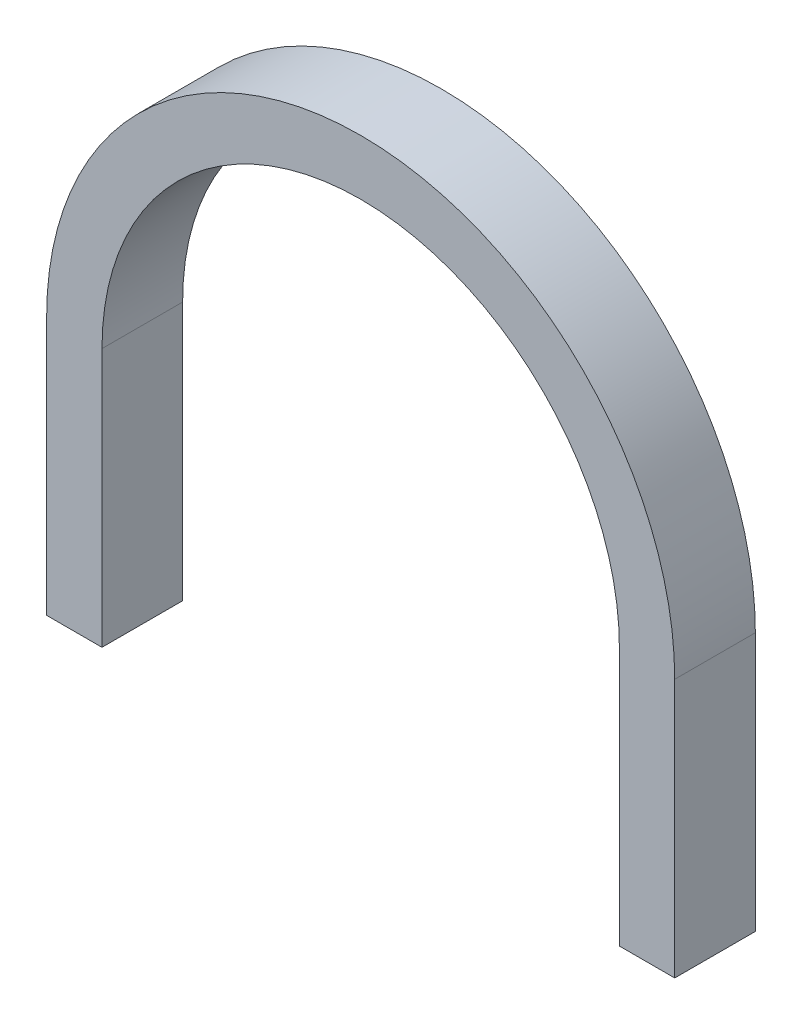
ISO-10303-21;
HEADER;
FILE_DESCRIPTION(('STEP AP214'),'2;1');
FILE_NAME('part.step','',(''),(''),'','','');
FILE_SCHEMA(('AUTOMOTIVE_DESIGN { 1 0 10303 214 1 1 1 1 }'));
ENDSEC;
DATA;
#1=APPLICATION_CONTEXT('core data for automotive mechanical design processes');
#2=APPLICATION_PROTOCOL_DEFINITION('international standard','automotive_design',2000,#1);
#3=PRODUCT_CONTEXT('',#1,'mechanical');
#4=PRODUCT('Part','Part','',(#3));
#5=PRODUCT_RELATED_PRODUCT_CATEGORY('part','',(#4));
#6=PRODUCT_DEFINITION_FORMATION('','',#4);
#7=PRODUCT_DEFINITION_CONTEXT('part definition',#1,'design');
#8=PRODUCT_DEFINITION('design','',#6,#7);
#9=PRODUCT_DEFINITION_SHAPE('','',#8);
#10=(LENGTH_UNIT() NAMED_UNIT(*) SI_UNIT(.MILLI.,.METRE.));
#11=(NAMED_UNIT(*) PLANE_ANGLE_UNIT() SI_UNIT($,.RADIAN.));
#12=(NAMED_UNIT(*) SI_UNIT($,.STERADIAN.) SOLID_ANGLE_UNIT());
#13=UNCERTAINTY_MEASURE_WITH_UNIT(LENGTH_MEASURE(1.E-05),#10,'distance_accuracy_value','');
#14=(GEOMETRIC_REPRESENTATION_CONTEXT(3) GLOBAL_UNCERTAINTY_ASSIGNED_CONTEXT((#13)) GLOBAL_UNIT_ASSIGNED_CONTEXT((#10,
#11,#12)) REPRESENTATION_CONTEXT('',''));
#15=CARTESIAN_POINT('',(0.,0.,0.));
#16=DIRECTION('',(0.,0.,1.));
#17=DIRECTION('',(1.,0.,0.));
#18=AXIS2_PLACEMENT_3D('',#15,#16,#17);
#19=CARTESIAN_POINT('',(-12.192,0.,3.8));
#20=DIRECTION('',(-1.,0.,0.));
#21=DIRECTION('',(0.,-1.,0.));
#22=AXIS2_PLACEMENT_3D('',#19,#20,#21);
#23=PLANE('',#22);
#24=DIRECTION('',(0.,1.,0.));
#25=VECTOR('',#24,1.);
#26=CARTESIAN_POINT('',(-12.192,0.,0.));
#27=LINE('',#26,#25);
#28=CARTESIAN_POINT('',(-12.192,-12.192,0.));
#29=VERTEX_POINT('',#28);
#30=CARTESIAN_POINT('',(-12.192,0.,0.));
#31=VERTEX_POINT('',#30);
#32=EDGE_CURVE('E129',#29,#31,#27,.T.);
#33=ORIENTED_EDGE('',*,*,#32,.T.);
#34=DIRECTION('',(0.,0.,-1.));
#35=VECTOR('',#34,1.);
#36=CARTESIAN_POINT('',(-12.192,0.,3.8));
#37=LINE('',#36,#35);
#38=CARTESIAN_POINT('',(-12.192,0.,3.8));
#39=VERTEX_POINT('',#38);
#40=EDGE_CURVE('E11',#39,#31,#37,.T.);
#41=ORIENTED_EDGE('',*,*,#40,.F.);
#42=DIRECTION('',(0.,1.,0.));
#43=VECTOR('',#42,1.);
#44=CARTESIAN_POINT('',(-12.192,0.,3.8));
#45=LINE('',#44,#43);
#46=CARTESIAN_POINT('',(-12.192,-12.192,3.8));
#47=VERTEX_POINT('',#46);
#48=EDGE_CURVE('E143',#47,#39,#45,.T.);
#49=ORIENTED_EDGE('',*,*,#48,.F.);
#50=DIRECTION('',(0.,0.,-1.));
#51=VECTOR('',#50,1.);
#52=CARTESIAN_POINT('',(-12.192,-12.192,3.8));
#53=LINE('',#52,#51);
#54=EDGE_CURVE('E125',#47,#29,#53,.T.);
#55=ORIENTED_EDGE('',*,*,#54,.T.);
#56=EDGE_LOOP('',(#33,#41,#49,#55));
#57=FACE_BOUND('',#56,.T.);
#58=ADVANCED_FACE('F33',(#57),#23,.F.);
#59=CARTESIAN_POINT('',(0.,0.,3.8));
#60=DIRECTION('',(0.,0.,-1.));
#61=DIRECTION('',(-1.,0.,0.));
#62=AXIS2_PLACEMENT_3D('',#59,#60,#61);
#63=CYLINDRICAL_SURFACE('',#62,12.192);
#64=CARTESIAN_POINT('',(0.,0.,0.));
#65=DIRECTION('',(0.,0.,-1.));
#66=DIRECTION('',(1.,0.,0.));
#67=AXIS2_PLACEMENT_3D('',#64,#65,#66);
#68=CIRCLE('',#67,12.192);
#69=CARTESIAN_POINT('',(12.192,0.,0.));
#70=VERTEX_POINT('',#69);
#71=EDGE_CURVE('E132',#31,#70,#68,.T.);
#72=ORIENTED_EDGE('',*,*,#71,.T.);
#73=DIRECTION('',(0.,0.,-1.));
#74=VECTOR('',#73,1.);
#75=CARTESIAN_POINT('',(12.192,0.,3.8));
#76=LINE('',#75,#74);
#77=CARTESIAN_POINT('',(12.192,0.,3.8));
#78=VERTEX_POINT('',#77);
#79=EDGE_CURVE('E41',#78,#70,#76,.T.);
#80=ORIENTED_EDGE('',*,*,#79,.F.);
#81=CARTESIAN_POINT('',(0.,0.,3.8));
#82=DIRECTION('',(0.,0.,-1.));
#83=DIRECTION('',(1.,0.,0.));
#84=AXIS2_PLACEMENT_3D('',#81,#82,#83);
#85=CIRCLE('',#84,12.192);
#86=EDGE_CURVE('E92',#39,#78,#85,.T.);
#87=ORIENTED_EDGE('',*,*,#86,.F.);
#88=ORIENTED_EDGE('',*,*,#40,.T.);
#89=EDGE_LOOP('',(#72,#80,#87,#88));
#90=FACE_BOUND('',#89,.T.);
#91=ADVANCED_FACE('F178',(#90),#63,.F.);
#92=CARTESIAN_POINT('',(12.192,-12.192,3.8));
#93=DIRECTION('',(1.,0.,0.));
#94=DIRECTION('',(0.,1.,0.));
#95=AXIS2_PLACEMENT_3D('',#92,#93,#94);
#96=PLANE('',#95);
#97=DIRECTION('',(0.,-1.,0.));
#98=VECTOR('',#97,1.);
#99=CARTESIAN_POINT('',(12.192,-12.192,0.));
#100=LINE('',#99,#98);
#101=CARTESIAN_POINT('',(12.192,-12.192,0.));
#102=VERTEX_POINT('',#101);
#103=EDGE_CURVE('E134',#70,#102,#100,.T.);
#104=ORIENTED_EDGE('',*,*,#103,.T.);
#105=DIRECTION('',(0.,0.,-1.));
#106=VECTOR('',#105,1.);
#107=CARTESIAN_POINT('',(12.192,-12.192,3.8));
#108=LINE('',#107,#106);
#109=CARTESIAN_POINT('',(12.192,-12.192,3.8));
#110=VERTEX_POINT('',#109);
#111=EDGE_CURVE('E150',#110,#102,#108,.T.);
#112=ORIENTED_EDGE('',*,*,#111,.F.);
#113=DIRECTION('',(0.,-1.,0.));
#114=VECTOR('',#113,1.);
#115=CARTESIAN_POINT('',(12.192,-12.192,3.8));
#116=LINE('',#115,#114);
#117=EDGE_CURVE('E158',#78,#110,#116,.T.);
#118=ORIENTED_EDGE('',*,*,#117,.F.);
#119=ORIENTED_EDGE('',*,*,#79,.T.);
#120=EDGE_LOOP('',(#104,#112,#118,#119));
#121=FACE_BOUND('',#120,.T.);
#122=ADVANCED_FACE('F156',(#121),#96,.F.);
#123=CARTESIAN_POINT('',(14.8,-12.192,3.8));
#124=DIRECTION('',(0.,1.,0.));
#125=DIRECTION('',(0.,0.,1.));
#126=AXIS2_PLACEMENT_3D('',#123,#124,#125);
#127=PLANE('',#126);
#128=DIRECTION('',(1.,0.,0.));
#129=VECTOR('',#128,1.);
#130=CARTESIAN_POINT('',(14.8,-12.192,0.));
#131=LINE('',#130,#129);
#132=CARTESIAN_POINT('',(14.8,-12.192,0.));
#133=VERTEX_POINT('',#132);
#134=EDGE_CURVE('E136',#102,#133,#131,.T.);
#135=ORIENTED_EDGE('',*,*,#134,.T.);
#136=DIRECTION('',(0.,0.,-1.));
#137=VECTOR('',#136,1.);
#138=CARTESIAN_POINT('',(14.8,-12.192,3.8));
#139=LINE('',#138,#137);
#140=CARTESIAN_POINT('',(14.8,-12.192,3.8));
#141=VERTEX_POINT('',#140);
#142=EDGE_CURVE('E147',#141,#133,#139,.T.);
#143=ORIENTED_EDGE('',*,*,#142,.F.);
#144=DIRECTION('',(1.,0.,0.));
#145=VECTOR('',#144,1.);
#146=CARTESIAN_POINT('',(14.8,-12.192,3.8));
#147=LINE('',#146,#145);
#148=EDGE_CURVE('E170',#110,#141,#147,.T.);
#149=ORIENTED_EDGE('',*,*,#148,.F.);
#150=ORIENTED_EDGE('',*,*,#111,.T.);
#151=EDGE_LOOP('',(#135,#143,#149,#150));
#152=FACE_BOUND('',#151,.T.);
#153=ADVANCED_FACE('F166',(#152),#127,.F.);
#154=CARTESIAN_POINT('',(14.8,0.,3.8));
#155=DIRECTION('',(-1.,0.,0.));
#156=DIRECTION('',(0.,-1.,0.));
#157=AXIS2_PLACEMENT_3D('',#154,#155,#156);
#158=PLANE('',#157);
#159=DIRECTION('',(0.,1.,0.));
#160=VECTOR('',#159,1.);
#161=CARTESIAN_POINT('',(14.8,0.,0.));
#162=LINE('',#161,#160);
#163=CARTESIAN_POINT('',(14.8,0.,0.));
#164=VERTEX_POINT('',#163);
#165=EDGE_CURVE('E138',#133,#164,#162,.T.);
#166=ORIENTED_EDGE('',*,*,#165,.T.);
#167=DIRECTION('',(0.,0.,-1.));
#168=VECTOR('',#167,1.);
#169=CARTESIAN_POINT('',(14.8,0.,3.8));
#170=LINE('',#169,#168);
#171=CARTESIAN_POINT('',(14.8,0.,3.8));
#172=VERTEX_POINT('',#171);
#173=EDGE_CURVE('E120',#172,#164,#170,.T.);
#174=ORIENTED_EDGE('',*,*,#173,.F.);
#175=DIRECTION('',(0.,1.,0.));
#176=VECTOR('',#175,1.);
#177=CARTESIAN_POINT('',(14.8,0.,3.8));
#178=LINE('',#177,#176);
#179=EDGE_CURVE('E111',#141,#172,#178,.T.);
#180=ORIENTED_EDGE('',*,*,#179,.F.);
#181=ORIENTED_EDGE('',*,*,#142,.T.);
#182=EDGE_LOOP('',(#166,#174,#180,#181));
#183=FACE_BOUND('',#182,.T.);
#184=ADVANCED_FACE('F169',(#183),#158,.F.);
#185=CARTESIAN_POINT('',(0.,0.,3.8));
#186=DIRECTION('',(0.,0.,-1.));
#187=DIRECTION('',(-1.,0.,0.));
#188=AXIS2_PLACEMENT_3D('',#185,#186,#187);
#189=CYLINDRICAL_SURFACE('',#188,14.8);
#190=CARTESIAN_POINT('',(0.,0.,0.));
#191=DIRECTION('',(0.,0.,1.));
#192=DIRECTION('',(-1.,0.,0.));
#193=AXIS2_PLACEMENT_3D('',#190,#191,#192);
#194=CIRCLE('',#193,14.8);
#195=CARTESIAN_POINT('',(-14.8,0.,0.));
#196=VERTEX_POINT('',#195);
#197=EDGE_CURVE('E119',#164,#196,#194,.T.);
#198=ORIENTED_EDGE('',*,*,#197,.T.);
#199=DIRECTION('',(0.,0.,-1.));
#200=VECTOR('',#199,1.);
#201=CARTESIAN_POINT('',(-14.8,0.,3.8));
#202=LINE('',#201,#200);
#203=CARTESIAN_POINT('',(-14.8,0.,3.8));
#204=VERTEX_POINT('',#203);
#205=EDGE_CURVE('E116',#204,#196,#202,.T.);
#206=ORIENTED_EDGE('',*,*,#205,.F.);
#207=CARTESIAN_POINT('',(0.,0.,3.8));
#208=DIRECTION('',(0.,0.,1.));
#209=DIRECTION('',(-1.,0.,0.));
#210=AXIS2_PLACEMENT_3D('',#207,#208,#209);
#211=CIRCLE('',#210,14.8);
#212=EDGE_CURVE('E105',#172,#204,#211,.T.);
#213=ORIENTED_EDGE('',*,*,#212,.F.);
#214=ORIENTED_EDGE('',*,*,#173,.T.);
#215=EDGE_LOOP('',(#198,#206,#213,#214));
#216=FACE_BOUND('',#215,.T.);
#217=ADVANCED_FACE('F117',(#216),#189,.T.);
#218=CARTESIAN_POINT('',(-14.8,-12.192,3.8));
#219=DIRECTION('',(1.,0.,0.));
#220=DIRECTION('',(0.,1.,0.));
#221=AXIS2_PLACEMENT_3D('',#218,#219,#220);
#222=PLANE('',#221);
#223=DIRECTION('',(0.,-1.,0.));
#224=VECTOR('',#223,1.);
#225=CARTESIAN_POINT('',(-14.8,-12.192,0.));
#226=LINE('',#225,#224);
#227=CARTESIAN_POINT('',(-14.8,-12.192,0.));
#228=VERTEX_POINT('',#227);
#229=EDGE_CURVE('E78',#196,#228,#226,.T.);
#230=ORIENTED_EDGE('',*,*,#229,.T.);
#231=DIRECTION('',(0.,0.,-1.));
#232=VECTOR('',#231,1.);
#233=CARTESIAN_POINT('',(-14.8,-12.192,3.8));
#234=LINE('',#233,#232);
#235=CARTESIAN_POINT('',(-14.8,-12.192,3.8));
#236=VERTEX_POINT('',#235);
#237=EDGE_CURVE('E121',#236,#228,#234,.T.);
#238=ORIENTED_EDGE('',*,*,#237,.F.);
#239=DIRECTION('',(0.,-1.,0.));
#240=VECTOR('',#239,1.);
#241=CARTESIAN_POINT('',(-14.8,-12.192,3.8));
#242=LINE('',#241,#240);
#243=EDGE_CURVE('E109',#204,#236,#242,.T.);
#244=ORIENTED_EDGE('',*,*,#243,.F.);
#245=ORIENTED_EDGE('',*,*,#205,.T.);
#246=EDGE_LOOP('',(#230,#238,#244,#245));
#247=FACE_BOUND('',#246,.T.);
#248=ADVANCED_FACE('F123',(#247),#222,.F.);
#249=CARTESIAN_POINT('',(-12.192,-12.192,3.8));
#250=DIRECTION('',(0.,1.,0.));
#251=DIRECTION('',(0.,0.,1.));
#252=AXIS2_PLACEMENT_3D('',#249,#250,#251);
#253=PLANE('',#252);
#254=DIRECTION('',(1.,0.,0.));
#255=VECTOR('',#254,1.);
#256=CARTESIAN_POINT('',(-12.192,-12.192,0.));
#257=LINE('',#256,#255);
#258=EDGE_CURVE('E84',#228,#29,#257,.T.);
#259=ORIENTED_EDGE('',*,*,#258,.T.);
#260=ORIENTED_EDGE('',*,*,#54,.F.);
#261=DIRECTION('',(1.,0.,0.));
#262=VECTOR('',#261,1.);
#263=CARTESIAN_POINT('',(-12.192,-12.192,3.8));
#264=LINE('',#263,#262);
#265=EDGE_CURVE('E49',#236,#47,#264,.T.);
#266=ORIENTED_EDGE('',*,*,#265,.F.);
#267=ORIENTED_EDGE('',*,*,#237,.T.);
#268=EDGE_LOOP('',(#259,#260,#266,#267));
#269=FACE_BOUND('',#268,.T.);
#270=ADVANCED_FACE('F194',(#269),#253,.F.);
#271=CARTESIAN_POINT('',(0.,0.,3.8));
#272=DIRECTION('',(0.,0.,-1.));
#273=DIRECTION('',(-1.,0.,0.));
#274=AXIS2_PLACEMENT_3D('',#271,#272,#273);
#275=PLANE('',#274);
#276=ORIENTED_EDGE('',*,*,#48,.T.);
#277=ORIENTED_EDGE('',*,*,#86,.T.);
#278=ORIENTED_EDGE('',*,*,#117,.T.);
#279=ORIENTED_EDGE('',*,*,#148,.T.);
#280=ORIENTED_EDGE('',*,*,#179,.T.);
#281=ORIENTED_EDGE('',*,*,#212,.T.);
#282=ORIENTED_EDGE('',*,*,#243,.T.);
#283=ORIENTED_EDGE('',*,*,#265,.T.);
#284=EDGE_LOOP('',(#276,#277,#278,#279,#280,#281,#282,#283));
#285=FACE_BOUND('',#284,.T.);
#286=ADVANCED_FACE('F107',(#285),#275,.F.);
#287=CARTESIAN_POINT('',(0.,0.,0.));
#288=DIRECTION('',(0.,0.,-1.));
#289=DIRECTION('',(-1.,0.,0.));
#290=AXIS2_PLACEMENT_3D('',#287,#288,#289);
#291=PLANE('',#290);
#292=ORIENTED_EDGE('',*,*,#32,.F.);
#293=ORIENTED_EDGE('',*,*,#258,.F.);
#294=ORIENTED_EDGE('',*,*,#229,.F.);
#295=ORIENTED_EDGE('',*,*,#197,.F.);
#296=ORIENTED_EDGE('',*,*,#165,.F.);
#297=ORIENTED_EDGE('',*,*,#134,.F.);
#298=ORIENTED_EDGE('',*,*,#103,.F.);
#299=ORIENTED_EDGE('',*,*,#71,.F.);
#300=EDGE_LOOP('',(#292,#293,#294,#295,#296,#297,#298,#299));
#301=FACE_BOUND('',#300,.T.);
#302=ADVANCED_FACE('F162',(#301),#291,.T.);
#303=CLOSED_SHELL('',(#58,#91,#122,#153,#184,#217,#248,#270,#286,#302));
#304=MANIFOLD_SOLID_BREP('B2',#303);
#305=ADVANCED_BREP_SHAPE_REPRESENTATION('',(#18,#304),#14);
#306=SHAPE_DEFINITION_REPRESENTATION(#9,#305);
ENDSEC;
END-ISO-10303-21;
